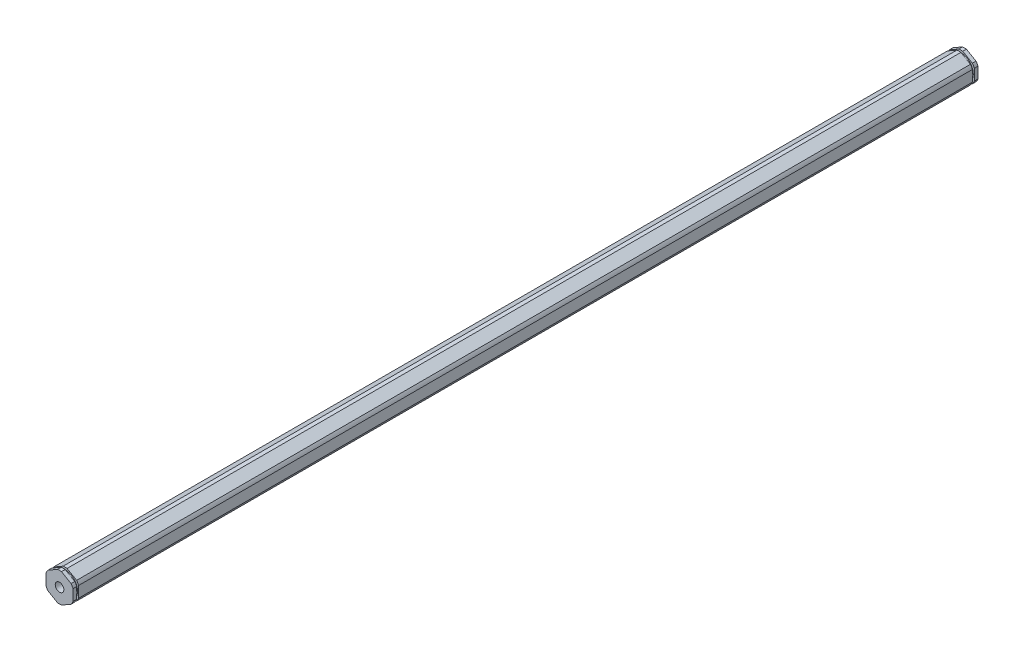
ISO-10303-21;
HEADER;
FILE_DESCRIPTION(('STEP AP214'),'2;1');
FILE_NAME('part.step','',(''),(''),'','','');
FILE_SCHEMA(('AUTOMOTIVE_DESIGN { 1 0 10303 214 1 1 1 1 }'));
ENDSEC;
DATA;
#1=APPLICATION_CONTEXT('core data for automotive mechanical design processes');
#2=APPLICATION_PROTOCOL_DEFINITION('international standard','automotive_design',2000,#1);
#3=PRODUCT_CONTEXT('',#1,'mechanical');
#4=PRODUCT('Part','Part','',(#3));
#5=PRODUCT_RELATED_PRODUCT_CATEGORY('part','',(#4));
#6=PRODUCT_DEFINITION_FORMATION('','',#4);
#7=PRODUCT_DEFINITION_CONTEXT('part definition',#1,'design');
#8=PRODUCT_DEFINITION('design','',#6,#7);
#9=PRODUCT_DEFINITION_SHAPE('','',#8);
#10=(LENGTH_UNIT() NAMED_UNIT(*) SI_UNIT(.MILLI.,.METRE.));
#11=(NAMED_UNIT(*) PLANE_ANGLE_UNIT() SI_UNIT($,.RADIAN.));
#12=(NAMED_UNIT(*) SI_UNIT($,.STERADIAN.) SOLID_ANGLE_UNIT());
#13=UNCERTAINTY_MEASURE_WITH_UNIT(LENGTH_MEASURE(1.E-05),#10,'distance_accuracy_value','');
#14=(GEOMETRIC_REPRESENTATION_CONTEXT(3) GLOBAL_UNCERTAINTY_ASSIGNED_CONTEXT((#13)) GLOBAL_UNIT_ASSIGNED_CONTEXT((#10,
#11,#12)) REPRESENTATION_CONTEXT('',''));
#15=CARTESIAN_POINT('',(0.,0.,0.));
#16=DIRECTION('',(0.,0.,1.));
#17=DIRECTION('',(1.,0.,0.));
#18=AXIS2_PLACEMENT_3D('',#15,#16,#17);
#19=CARTESIAN_POINT('',(0.,0.,212.22335));
#20=DIRECTION('',(0.,0.,-1.));
#21=DIRECTION('',(-1.,0.,0.));
#22=AXIS2_PLACEMENT_3D('',#19,#20,#21);
#23=CYLINDRICAL_SURFACE('',#22,6.858);
#24=CARTESIAN_POINT('',(0.,0.,-209.61985));
#25=DIRECTION('',(0.,0.,1.));
#26=DIRECTION('',(1.,0.,0.));
#27=AXIS2_PLACEMENT_3D('',#24,#25,#26);
#28=CIRCLE('',#27,6.858);
#29=CARTESIAN_POINT('',(5.41826726004727,-4.20411035757862,-209.61985));
#30=VERTEX_POINT('',#29);
#31=CARTESIAN_POINT('',(6.35,-2.59030191290513,-209.61985));
#32=VERTEX_POINT('',#31);
#33=EDGE_CURVE('E309',#30,#32,#28,.T.);
#34=ORIENTED_EDGE('',*,*,#33,.T.);
#35=DIRECTION('',(0.,0.,-1.));
#36=VECTOR('',#35,1.);
#37=CARTESIAN_POINT('',(6.35,-2.59030191290513,212.22335));
#38=LINE('',#37,#36);
#39=CARTESIAN_POINT('',(6.35,-2.59030191290513,209.61985));
#40=VERTEX_POINT('',#39);
#41=EDGE_CURVE('E351',#40,#32,#38,.T.);
#42=ORIENTED_EDGE('',*,*,#41,.F.);
#43=CARTESIAN_POINT('',(0.,0.,209.61985));
#44=DIRECTION('',(0.,0.,1.));
#45=DIRECTION('',(1.,0.,0.));
#46=AXIS2_PLACEMENT_3D('',#43,#44,#45);
#47=CIRCLE('',#46,6.858);
#48=CARTESIAN_POINT('',(5.41826726004727,-4.20411035757862,209.61985));
#49=VERTEX_POINT('',#48);
#50=EDGE_CURVE('E330',#49,#40,#47,.T.);
#51=ORIENTED_EDGE('',*,*,#50,.F.);
#52=DIRECTION('',(0.,0.,-1.));
#53=VECTOR('',#52,1.);
#54=CARTESIAN_POINT('',(5.41826726004727,-4.20411035757862,212.22335));
#55=LINE('',#54,#53);
#56=EDGE_CURVE('E353',#49,#30,#55,.T.);
#57=ORIENTED_EDGE('',*,*,#56,.T.);
#58=EDGE_LOOP('',(#34,#42,#51,#57));
#59=FACE_BOUND('',#58,.T.);
#60=ADVANCED_FACE('F58',(#59),#23,.T.);
#61=CARTESIAN_POINT('',(3.175,-5.49926131403118,212.22335));
#62=DIRECTION('',(-0.5,0.866025403784439,0.));
#63=DIRECTION('',(-0.866025403784439,-0.5,0.));
#64=AXIS2_PLACEMENT_3D('',#61,#62,#63);
#65=PLANE('',#64);
#66=DIRECTION('',(-0.866025403784439,-0.5,0.));
#67=VECTOR('',#66,1.);
#68=CARTESIAN_POINT('',(3.175,-5.49926131403118,-209.61985));
#69=LINE('',#68,#67);
#70=CARTESIAN_POINT('',(0.931732739952731,-6.79441227048375,-209.61985));
#71=VERTEX_POINT('',#70);
#72=EDGE_CURVE('E611',#30,#71,#69,.T.);
#73=ORIENTED_EDGE('',*,*,#72,.F.);
#74=ORIENTED_EDGE('',*,*,#56,.F.);
#75=DIRECTION('',(0.866025403784439,0.5,0.));
#76=VECTOR('',#75,1.);
#77=CARTESIAN_POINT('',(3.175,-5.49926131403118,209.61985));
#78=LINE('',#77,#76);
#79=CARTESIAN_POINT('',(0.931732739952729,-6.79441227048375,209.61985));
#80=VERTEX_POINT('',#79);
#81=EDGE_CURVE('E575',#80,#49,#78,.T.);
#82=ORIENTED_EDGE('',*,*,#81,.F.);
#83=DIRECTION('',(0.,0.,-1.));
#84=VECTOR('',#83,1.);
#85=CARTESIAN_POINT('',(0.931732739952731,-6.79441227048375,212.22335));
#86=LINE('',#85,#84);
#87=EDGE_CURVE('E382',#80,#71,#86,.T.);
#88=ORIENTED_EDGE('',*,*,#87,.T.);
#89=EDGE_LOOP('',(#73,#74,#82,#88));
#90=FACE_BOUND('',#89,.T.);
#91=ADVANCED_FACE('F669',(#90),#65,.F.);
#92=CARTESIAN_POINT('',(-0.931732739952719,-6.79441227048375,-209.61985));
#93=VERTEX_POINT('',#92);
#94=EDGE_CURVE('E355',#93,#71,#28,.T.);
#95=ORIENTED_EDGE('',*,*,#94,.T.);
#96=ORIENTED_EDGE('',*,*,#87,.F.);
#97=CARTESIAN_POINT('',(0.,0.,209.61985));
#98=DIRECTION('',(0.,0.,1.));
#99=DIRECTION('',(1.,0.,0.));
#100=AXIS2_PLACEMENT_3D('',#97,#98,#99);
#101=CIRCLE('',#100,6.858);
#102=CARTESIAN_POINT('',(-0.931732739952721,-6.79441227048375,209.61985));
#103=VERTEX_POINT('',#102);
#104=EDGE_CURVE('E590',#103,#80,#101,.T.);
#105=ORIENTED_EDGE('',*,*,#104,.F.);
#106=DIRECTION('',(0.,0.,-1.));
#107=VECTOR('',#106,1.);
#108=CARTESIAN_POINT('',(-0.931732739952721,-6.79441227048375,212.22335));
#109=LINE('',#108,#107);
#110=EDGE_CURVE('E388',#103,#93,#109,.T.);
#111=ORIENTED_EDGE('',*,*,#110,.T.);
#112=EDGE_LOOP('',(#95,#96,#105,#111));
#113=FACE_BOUND('',#112,.T.);
#114=ADVANCED_FACE('F663',(#113),#23,.T.);
#115=CARTESIAN_POINT('',(-3.175,-5.49926131403118,212.22335));
#116=DIRECTION('',(0.5,0.866025403784439,0.));
#117=DIRECTION('',(-0.866025403784439,0.5,0.));
#118=AXIS2_PLACEMENT_3D('',#115,#116,#117);
#119=PLANE('',#118);
#120=DIRECTION('',(-0.866025403784439,0.5,0.));
#121=VECTOR('',#120,1.);
#122=CARTESIAN_POINT('',(-3.175,-5.49926131403118,-209.61985));
#123=LINE('',#122,#121);
#124=CARTESIAN_POINT('',(-5.41826726004728,-4.20411035757862,-209.61985));
#125=VERTEX_POINT('',#124);
#126=EDGE_CURVE('E614',#93,#125,#123,.T.);
#127=ORIENTED_EDGE('',*,*,#126,.F.);
#128=ORIENTED_EDGE('',*,*,#110,.F.);
#129=DIRECTION('',(0.866025403784439,-0.5,0.));
#130=VECTOR('',#129,1.);
#131=CARTESIAN_POINT('',(-3.175,-5.49926131403118,209.61985));
#132=LINE('',#131,#130);
#133=CARTESIAN_POINT('',(-5.41826726004728,-4.20411035757861,209.61985));
#134=VERTEX_POINT('',#133);
#135=EDGE_CURVE('E572',#134,#103,#132,.T.);
#136=ORIENTED_EDGE('',*,*,#135,.F.);
#137=DIRECTION('',(0.,0.,-1.));
#138=VECTOR('',#137,1.);
#139=CARTESIAN_POINT('',(-5.41826726004728,-4.20411035757862,212.22335));
#140=LINE('',#139,#138);
#141=EDGE_CURVE('E394',#134,#125,#140,.T.);
#142=ORIENTED_EDGE('',*,*,#141,.T.);
#143=EDGE_LOOP('',(#127,#128,#136,#142));
#144=FACE_BOUND('',#143,.T.);
#145=ADVANCED_FACE('F725',(#144),#119,.F.);
#146=CARTESIAN_POINT('',(-6.35,-2.59030191290515,-209.61985));
#147=VERTEX_POINT('',#146);
#148=EDGE_CURVE('E646',#147,#125,#28,.T.);
#149=ORIENTED_EDGE('',*,*,#148,.T.);
#150=ORIENTED_EDGE('',*,*,#141,.F.);
#151=CARTESIAN_POINT('',(-6.35,-2.59030191290514,209.61985));
#152=VERTEX_POINT('',#151);
#153=EDGE_CURVE('E718',#152,#134,#101,.T.);
#154=ORIENTED_EDGE('',*,*,#153,.F.);
#155=DIRECTION('',(0.,0.,-1.));
#156=VECTOR('',#155,1.);
#157=CARTESIAN_POINT('',(-6.35,-2.59030191290514,212.22335));
#158=LINE('',#157,#156);
#159=EDGE_CURVE('E400',#152,#147,#158,.T.);
#160=ORIENTED_EDGE('',*,*,#159,.T.);
#161=EDGE_LOOP('',(#149,#150,#154,#160));
#162=FACE_BOUND('',#161,.T.);
#163=ADVANCED_FACE('F717',(#162),#23,.T.);
#164=CARTESIAN_POINT('',(-6.35,0.,212.22335));
#165=DIRECTION('',(1.,0.,0.));
#166=DIRECTION('',(0.,1.,0.));
#167=AXIS2_PLACEMENT_3D('',#164,#165,#166);
#168=PLANE('',#167);
#169=DIRECTION('',(0.,1.,0.));
#170=VECTOR('',#169,1.);
#171=CARTESIAN_POINT('',(-6.35,0.,-209.61985));
#172=LINE('',#171,#170);
#173=CARTESIAN_POINT('',(-6.35,2.59030191290514,-209.61985));
#174=VERTEX_POINT('',#173);
#175=EDGE_CURVE('E617',#147,#174,#172,.T.);
#176=ORIENTED_EDGE('',*,*,#175,.F.);
#177=ORIENTED_EDGE('',*,*,#159,.F.);
#178=DIRECTION('',(0.,-1.,0.));
#179=VECTOR('',#178,1.);
#180=CARTESIAN_POINT('',(-6.35,0.,209.61985));
#181=LINE('',#180,#179);
#182=CARTESIAN_POINT('',(-6.35,2.59030191290514,209.61985));
#183=VERTEX_POINT('',#182);
#184=EDGE_CURVE('E569',#183,#152,#181,.T.);
#185=ORIENTED_EDGE('',*,*,#184,.F.);
#186=DIRECTION('',(0.,0.,-1.));
#187=VECTOR('',#186,1.);
#188=CARTESIAN_POINT('',(-6.35,2.59030191290514,212.22335));
#189=LINE('',#188,#187);
#190=EDGE_CURVE('E406',#183,#174,#189,.T.);
#191=ORIENTED_EDGE('',*,*,#190,.T.);
#192=EDGE_LOOP('',(#176,#177,#185,#191));
#193=FACE_BOUND('',#192,.T.);
#194=ADVANCED_FACE('F714',(#193),#168,.F.);
#195=CARTESIAN_POINT('',(-5.41826726004727,4.20411035757862,-209.61985));
#196=VERTEX_POINT('',#195);
#197=EDGE_CURVE('E640',#196,#174,#28,.T.);
#198=ORIENTED_EDGE('',*,*,#197,.T.);
#199=ORIENTED_EDGE('',*,*,#190,.F.);
#200=CARTESIAN_POINT('',(-5.41826726004727,4.20411035757862,209.61985));
#201=VERTEX_POINT('',#200);
#202=EDGE_CURVE('E706',#201,#183,#101,.T.);
#203=ORIENTED_EDGE('',*,*,#202,.F.);
#204=DIRECTION('',(0.,0.,-1.));
#205=VECTOR('',#204,1.);
#206=CARTESIAN_POINT('',(-5.41826726004727,4.20411035757862,212.22335));
#207=LINE('',#206,#205);
#208=EDGE_CURVE('E412',#201,#196,#207,.T.);
#209=ORIENTED_EDGE('',*,*,#208,.T.);
#210=EDGE_LOOP('',(#198,#199,#203,#209));
#211=FACE_BOUND('',#210,.T.);
#212=ADVANCED_FACE('F823',(#211),#23,.T.);
#213=CARTESIAN_POINT('',(-3.175,5.49926131403119,212.22335));
#214=DIRECTION('',(0.5,-0.866025403784438,0.));
#215=DIRECTION('',(0.866025403784439,0.5,0.));
#216=AXIS2_PLACEMENT_3D('',#213,#214,#215);
#217=PLANE('',#216);
#218=DIRECTION('',(0.866025403784439,0.5,0.));
#219=VECTOR('',#218,1.);
#220=CARTESIAN_POINT('',(-3.175,5.49926131403119,-209.61985));
#221=LINE('',#220,#219);
#222=CARTESIAN_POINT('',(-0.931732739952731,6.79441227048375,-209.61985));
#223=VERTEX_POINT('',#222);
#224=EDGE_CURVE('E620',#196,#223,#221,.T.);
#225=ORIENTED_EDGE('',*,*,#224,.F.);
#226=ORIENTED_EDGE('',*,*,#208,.F.);
#227=DIRECTION('',(-0.866025403784439,-0.5,0.));
#228=VECTOR('',#227,1.);
#229=CARTESIAN_POINT('',(-3.175,5.49926131403119,209.61985));
#230=LINE('',#229,#228);
#231=CARTESIAN_POINT('',(-0.931732739952728,6.79441227048375,209.61985));
#232=VERTEX_POINT('',#231);
#233=EDGE_CURVE('E566',#232,#201,#230,.T.);
#234=ORIENTED_EDGE('',*,*,#233,.F.);
#235=DIRECTION('',(0.,0.,-1.));
#236=VECTOR('',#235,1.);
#237=CARTESIAN_POINT('',(-0.931732739952731,6.79441227048375,212.22335));
#238=LINE('',#237,#236);
#239=EDGE_CURVE('E418',#232,#223,#238,.T.);
#240=ORIENTED_EDGE('',*,*,#239,.T.);
#241=EDGE_LOOP('',(#225,#226,#234,#240));
#242=FACE_BOUND('',#241,.T.);
#243=ADVANCED_FACE('F700',(#242),#217,.F.);
#244=CARTESIAN_POINT('',(0.931732739952728,6.79441227048375,-209.61985));
#245=VERTEX_POINT('',#244);
#246=EDGE_CURVE('E634',#245,#223,#28,.T.);
#247=ORIENTED_EDGE('',*,*,#246,.T.);
#248=ORIENTED_EDGE('',*,*,#239,.F.);
#249=CARTESIAN_POINT('',(0.931732739952733,6.79441227048375,209.61985));
#250=VERTEX_POINT('',#249);
#251=EDGE_CURVE('E589',#250,#232,#101,.T.);
#252=ORIENTED_EDGE('',*,*,#251,.F.);
#253=DIRECTION('',(0.,0.,-1.));
#254=VECTOR('',#253,1.);
#255=CARTESIAN_POINT('',(0.931732739952733,6.79441227048375,212.22335));
#256=LINE('',#255,#254);
#257=EDGE_CURVE('E422',#250,#245,#256,.T.);
#258=ORIENTED_EDGE('',*,*,#257,.T.);
#259=EDGE_LOOP('',(#247,#248,#252,#258));
#260=FACE_BOUND('',#259,.T.);
#261=ADVANCED_FACE('F703',(#260),#23,.T.);
#262=CARTESIAN_POINT('',(3.175,5.49926131403119,212.22335));
#263=DIRECTION('',(-0.5,-0.866025403784438,0.));
#264=DIRECTION('',(0.866025403784439,-0.5,0.));
#265=AXIS2_PLACEMENT_3D('',#262,#263,#264);
#266=PLANE('',#265);
#267=DIRECTION('',(0.866025403784439,-0.5,0.));
#268=VECTOR('',#267,1.);
#269=CARTESIAN_POINT('',(3.175,5.49926131403119,-209.61985));
#270=LINE('',#269,#268);
#271=CARTESIAN_POINT('',(5.41826726004727,4.20411035757862,-209.61985));
#272=VERTEX_POINT('',#271);
#273=EDGE_CURVE('E623',#245,#272,#270,.T.);
#274=ORIENTED_EDGE('',*,*,#273,.F.);
#275=ORIENTED_EDGE('',*,*,#257,.F.);
#276=DIRECTION('',(-0.866025403784439,0.5,0.));
#277=VECTOR('',#276,1.);
#278=CARTESIAN_POINT('',(3.175,5.49926131403119,209.61985));
#279=LINE('',#278,#277);
#280=CARTESIAN_POINT('',(5.41826726004727,4.20411035757862,209.61985));
#281=VERTEX_POINT('',#280);
#282=EDGE_CURVE('E563',#281,#250,#279,.T.);
#283=ORIENTED_EDGE('',*,*,#282,.F.);
#284=DIRECTION('',(0.,0.,-1.));
#285=VECTOR('',#284,1.);
#286=CARTESIAN_POINT('',(5.41826726004727,4.20411035757862,212.22335));
#287=LINE('',#286,#285);
#288=EDGE_CURVE('E325',#281,#272,#287,.T.);
#289=ORIENTED_EDGE('',*,*,#288,.T.);
#290=EDGE_LOOP('',(#274,#275,#283,#289));
#291=FACE_BOUND('',#290,.T.);
#292=ADVANCED_FACE('F710',(#291),#266,.F.);
#293=CARTESIAN_POINT('',(6.35,2.59030191290513,-209.61985));
#294=VERTEX_POINT('',#293);
#295=EDGE_CURVE('E74',#294,#272,#28,.T.);
#296=ORIENTED_EDGE('',*,*,#295,.T.);
#297=ORIENTED_EDGE('',*,*,#288,.F.);
#298=CARTESIAN_POINT('',(6.35,2.59030191290513,209.61985));
#299=VERTEX_POINT('',#298);
#300=EDGE_CURVE('E586',#299,#281,#101,.T.);
#301=ORIENTED_EDGE('',*,*,#300,.F.);
#302=DIRECTION('',(0.,0.,-1.));
#303=VECTOR('',#302,1.);
#304=CARTESIAN_POINT('',(6.35,2.59030191290513,212.22335));
#305=LINE('',#304,#303);
#306=EDGE_CURVE('E317',#299,#294,#305,.T.);
#307=ORIENTED_EDGE('',*,*,#306,.T.);
#308=EDGE_LOOP('',(#296,#297,#301,#307));
#309=FACE_BOUND('',#308,.T.);
#310=ADVANCED_FACE('F806',(#309),#23,.T.);
#311=CARTESIAN_POINT('',(6.35,0.,212.22335));
#312=DIRECTION('',(-1.,0.,0.));
#313=DIRECTION('',(0.,-1.,0.));
#314=AXIS2_PLACEMENT_3D('',#311,#312,#313);
#315=PLANE('',#314);
#316=DIRECTION('',(0.,-1.,0.));
#317=VECTOR('',#316,1.);
#318=CARTESIAN_POINT('',(6.35,0.,-209.61985));
#319=LINE('',#318,#317);
#320=EDGE_CURVE('E67',#294,#32,#319,.T.);
#321=ORIENTED_EDGE('',*,*,#320,.F.);
#322=ORIENTED_EDGE('',*,*,#306,.F.);
#323=DIRECTION('',(0.,1.,0.));
#324=VECTOR('',#323,1.);
#325=CARTESIAN_POINT('',(6.35,0.,209.61985));
#326=LINE('',#325,#324);
#327=EDGE_CURVE('E358',#40,#299,#326,.T.);
#328=ORIENTED_EDGE('',*,*,#327,.F.);
#329=ORIENTED_EDGE('',*,*,#41,.T.);
#330=EDGE_LOOP('',(#321,#322,#328,#329));
#331=FACE_BOUND('',#330,.T.);
#332=ADVANCED_FACE('F357',(#331),#315,.F.);
#333=DIRECTION('',(0.,-1.,0.));
#334=VECTOR('',#333,1.);
#335=CARTESIAN_POINT('',(6.35,0.,210.50885));
#336=LINE('',#335,#334);
#337=CARTESIAN_POINT('',(6.35,2.59030191290513,210.50885));
#338=VERTEX_POINT('',#337);
#339=CARTESIAN_POINT('',(6.35,-2.59030191290513,210.50885));
#340=VERTEX_POINT('',#339);
#341=EDGE_CURVE('E543',#338,#340,#336,.T.);
#342=ORIENTED_EDGE('',*,*,#341,.F.);
#343=CARTESIAN_POINT('',(6.35,2.59030191290513,212.22335));
#344=VERTEX_POINT('',#343);
#345=EDGE_CURVE('E320',#344,#338,#305,.T.);
#346=ORIENTED_EDGE('',*,*,#345,.F.);
#347=DIRECTION('',(0.,1.,0.));
#348=VECTOR('',#347,1.);
#349=CARTESIAN_POINT('',(6.35,0.,212.22335));
#350=LINE('',#349,#348);
#351=CARTESIAN_POINT('',(6.35,-2.59030191290513,212.22335));
#352=VERTEX_POINT('',#351);
#353=EDGE_CURVE('E491',#352,#344,#350,.T.);
#354=ORIENTED_EDGE('',*,*,#353,.F.);
#355=EDGE_CURVE('E360',#352,#340,#38,.T.);
#356=ORIENTED_EDGE('',*,*,#355,.T.);
#357=EDGE_LOOP('',(#342,#346,#354,#356));
#358=FACE_BOUND('',#357,.T.);
#359=ADVANCED_FACE('F60',(#358),#315,.F.);
#360=CARTESIAN_POINT('',(0.,0.,210.50885));
#361=DIRECTION('',(0.,0.,1.));
#362=DIRECTION('',(1.,0.,0.));
#363=AXIS2_PLACEMENT_3D('',#360,#361,#362);
#364=CIRCLE('',#363,6.858);
#365=CARTESIAN_POINT('',(5.41826726004727,4.20411035757862,210.50885));
#366=VERTEX_POINT('',#365);
#367=EDGE_CURVE('E591',#338,#366,#364,.T.);
#368=ORIENTED_EDGE('',*,*,#367,.T.);
#369=CARTESIAN_POINT('',(5.41826726004727,4.20411035757862,212.22335));
#370=VERTEX_POINT('',#369);
#371=EDGE_CURVE('E318',#370,#366,#287,.T.);
#372=ORIENTED_EDGE('',*,*,#371,.F.);
#373=CARTESIAN_POINT('',(0.,0.,212.22335));
#374=DIRECTION('',(0.,0.,1.));
#375=DIRECTION('',(1.,0.,0.));
#376=AXIS2_PLACEMENT_3D('',#373,#374,#375);
#377=CIRCLE('',#376,6.858);
#378=EDGE_CURVE('E496',#344,#370,#377,.T.);
#379=ORIENTED_EDGE('',*,*,#378,.F.);
#380=ORIENTED_EDGE('',*,*,#345,.T.);
#381=EDGE_LOOP('',(#368,#372,#379,#380));
#382=FACE_BOUND('',#381,.T.);
#383=ADVANCED_FACE('F750',(#382),#23,.T.);
#384=DIRECTION('',(0.866025403784439,-0.5,0.));
#385=VECTOR('',#384,1.);
#386=CARTESIAN_POINT('',(3.175,5.49926131403119,210.50885));
#387=LINE('',#386,#385);
#388=CARTESIAN_POINT('',(0.931732739952733,6.79441227048375,210.50885));
#389=VERTEX_POINT('',#388);
#390=EDGE_CURVE('E546',#389,#366,#387,.T.);
#391=ORIENTED_EDGE('',*,*,#390,.F.);
#392=CARTESIAN_POINT('',(0.931732739952733,6.79441227048375,212.22335));
#393=VERTEX_POINT('',#392);
#394=EDGE_CURVE('E419',#393,#389,#256,.T.);
#395=ORIENTED_EDGE('',*,*,#394,.F.);
#396=DIRECTION('',(-0.866025403784439,0.5,0.));
#397=VECTOR('',#396,1.);
#398=CARTESIAN_POINT('',(3.175,5.49926131403119,212.22335));
#399=LINE('',#398,#397);
#400=EDGE_CURVE('E501',#370,#393,#399,.T.);
#401=ORIENTED_EDGE('',*,*,#400,.F.);
#402=ORIENTED_EDGE('',*,*,#371,.T.);
#403=EDGE_LOOP('',(#391,#395,#401,#402));
#404=FACE_BOUND('',#403,.T.);
#405=ADVANCED_FACE('F758',(#404),#266,.F.);
#406=CARTESIAN_POINT('',(-0.931732739952728,6.79441227048375,210.50885));
#407=VERTEX_POINT('',#406);
#408=EDGE_CURVE('E594',#389,#407,#364,.T.);
#409=ORIENTED_EDGE('',*,*,#408,.T.);
#410=CARTESIAN_POINT('',(-0.931732739952731,6.79441227048375,212.22335));
#411=VERTEX_POINT('',#410);
#412=EDGE_CURVE('E413',#411,#407,#238,.T.);
#413=ORIENTED_EDGE('',*,*,#412,.F.);
#414=EDGE_CURVE('E503',#393,#411,#377,.T.);
#415=ORIENTED_EDGE('',*,*,#414,.F.);
#416=ORIENTED_EDGE('',*,*,#394,.T.);
#417=EDGE_LOOP('',(#409,#413,#415,#416));
#418=FACE_BOUND('',#417,.T.);
#419=ADVANCED_FACE('F764',(#418),#23,.T.);
#420=DIRECTION('',(0.866025403784439,0.5,0.));
#421=VECTOR('',#420,1.);
#422=CARTESIAN_POINT('',(-3.175,5.49926131403119,210.50885));
#423=LINE('',#422,#421);
#424=CARTESIAN_POINT('',(-5.41826726004727,4.20411035757862,210.50885));
#425=VERTEX_POINT('',#424);
#426=EDGE_CURVE('E549',#425,#407,#423,.T.);
#427=ORIENTED_EDGE('',*,*,#426,.F.);
#428=CARTESIAN_POINT('',(-5.41826726004727,4.20411035757862,212.22335));
#429=VERTEX_POINT('',#428);
#430=EDGE_CURVE('E407',#429,#425,#207,.T.);
#431=ORIENTED_EDGE('',*,*,#430,.F.);
#432=DIRECTION('',(-0.866025403784439,-0.5,0.));
#433=VECTOR('',#432,1.);
#434=CARTESIAN_POINT('',(-3.175,5.49926131403119,212.22335));
#435=LINE('',#434,#433);
#436=EDGE_CURVE('E510',#411,#429,#435,.T.);
#437=ORIENTED_EDGE('',*,*,#436,.F.);
#438=ORIENTED_EDGE('',*,*,#412,.T.);
#439=EDGE_LOOP('',(#427,#431,#437,#438));
#440=FACE_BOUND('',#439,.T.);
#441=ADVANCED_FACE('F796',(#440),#217,.F.);
#442=CARTESIAN_POINT('',(-6.35,2.59030191290514,210.50885));
#443=VERTEX_POINT('',#442);
#444=EDGE_CURVE('E1191',#425,#443,#364,.T.);
#445=ORIENTED_EDGE('',*,*,#444,.T.);
#446=CARTESIAN_POINT('',(-6.35,2.59030191290514,212.22335));
#447=VERTEX_POINT('',#446);
#448=EDGE_CURVE('E401',#447,#443,#189,.T.);
#449=ORIENTED_EDGE('',*,*,#448,.F.);
#450=EDGE_CURVE('E513',#429,#447,#377,.T.);
#451=ORIENTED_EDGE('',*,*,#450,.F.);
#452=ORIENTED_EDGE('',*,*,#430,.T.);
#453=EDGE_LOOP('',(#445,#449,#451,#452));
#454=FACE_BOUND('',#453,.T.);
#455=ADVANCED_FACE('F788',(#454),#23,.T.);
#456=DIRECTION('',(0.,1.,0.));
#457=VECTOR('',#456,1.);
#458=CARTESIAN_POINT('',(-6.35,0.,210.50885));
#459=LINE('',#458,#457);
#460=CARTESIAN_POINT('',(-6.35,-2.59030191290514,210.50885));
#461=VERTEX_POINT('',#460);
#462=EDGE_CURVE('E552',#461,#443,#459,.T.);
#463=ORIENTED_EDGE('',*,*,#462,.F.);
#464=CARTESIAN_POINT('',(-6.35,-2.59030191290514,212.22335));
#465=VERTEX_POINT('',#464);
#466=EDGE_CURVE('E395',#465,#461,#158,.T.);
#467=ORIENTED_EDGE('',*,*,#466,.F.);
#468=DIRECTION('',(0.,-1.,0.));
#469=VECTOR('',#468,1.);
#470=CARTESIAN_POINT('',(-6.35,0.,212.22335));
#471=LINE('',#470,#469);
#472=EDGE_CURVE('E514',#447,#465,#471,.T.);
#473=ORIENTED_EDGE('',*,*,#472,.F.);
#474=ORIENTED_EDGE('',*,*,#448,.T.);
#475=EDGE_LOOP('',(#463,#467,#473,#474));
#476=FACE_BOUND('',#475,.T.);
#477=ADVANCED_FACE('F786',(#476),#168,.F.);
#478=CARTESIAN_POINT('',(-5.41826726004728,-4.20411035757861,210.50885));
#479=VERTEX_POINT('',#478);
#480=EDGE_CURVE('E1189',#461,#479,#364,.T.);
#481=ORIENTED_EDGE('',*,*,#480,.T.);
#482=CARTESIAN_POINT('',(-5.41826726004728,-4.20411035757862,212.22335));
#483=VERTEX_POINT('',#482);
#484=EDGE_CURVE('E389',#483,#479,#140,.T.);
#485=ORIENTED_EDGE('',*,*,#484,.F.);
#486=EDGE_CURVE('E517',#465,#483,#377,.T.);
#487=ORIENTED_EDGE('',*,*,#486,.F.);
#488=ORIENTED_EDGE('',*,*,#466,.T.);
#489=EDGE_LOOP('',(#481,#485,#487,#488));
#490=FACE_BOUND('',#489,.T.);
#491=ADVANCED_FACE('F740',(#490),#23,.T.);
#492=DIRECTION('',(-0.866025403784439,0.5,0.));
#493=VECTOR('',#492,1.);
#494=CARTESIAN_POINT('',(-3.175,-5.49926131403118,210.50885));
#495=LINE('',#494,#493);
#496=CARTESIAN_POINT('',(-0.931732739952721,-6.79441227048375,210.50885));
#497=VERTEX_POINT('',#496);
#498=EDGE_CURVE('E555',#497,#479,#495,.T.);
#499=ORIENTED_EDGE('',*,*,#498,.F.);
#500=CARTESIAN_POINT('',(-0.931732739952721,-6.79441227048375,212.22335));
#501=VERTEX_POINT('',#500);
#502=EDGE_CURVE('E383',#501,#497,#109,.T.);
#503=ORIENTED_EDGE('',*,*,#502,.F.);
#504=DIRECTION('',(0.866025403784439,-0.5,0.));
#505=VECTOR('',#504,1.);
#506=CARTESIAN_POINT('',(-3.175,-5.49926131403118,212.22335));
#507=LINE('',#506,#505);
#508=EDGE_CURVE('E518',#483,#501,#507,.T.);
#509=ORIENTED_EDGE('',*,*,#508,.F.);
#510=ORIENTED_EDGE('',*,*,#484,.T.);
#511=EDGE_LOOP('',(#499,#503,#509,#510));
#512=FACE_BOUND('',#511,.T.);
#513=ADVANCED_FACE('F728',(#512),#119,.F.);
#514=CARTESIAN_POINT('',(0.931732739952729,-6.79441227048375,210.50885));
#515=VERTEX_POINT('',#514);
#516=EDGE_CURVE('E595',#497,#515,#364,.T.);
#517=ORIENTED_EDGE('',*,*,#516,.T.);
#518=CARTESIAN_POINT('',(0.931732739952731,-6.79441227048375,212.22335));
#519=VERTEX_POINT('',#518);
#520=EDGE_CURVE('E377',#519,#515,#86,.T.);
#521=ORIENTED_EDGE('',*,*,#520,.F.);
#522=EDGE_CURVE('E521',#501,#519,#377,.T.);
#523=ORIENTED_EDGE('',*,*,#522,.F.);
#524=ORIENTED_EDGE('',*,*,#502,.T.);
#525=EDGE_LOOP('',(#517,#521,#523,#524));
#526=FACE_BOUND('',#525,.T.);
#527=ADVANCED_FACE('F739',(#526),#23,.T.);
#528=DIRECTION('',(-0.866025403784439,-0.5,0.));
#529=VECTOR('',#528,1.);
#530=CARTESIAN_POINT('',(3.175,-5.49926131403118,210.50885));
#531=LINE('',#530,#529);
#532=CARTESIAN_POINT('',(5.41826726004727,-4.20411035757862,210.50885));
#533=VERTEX_POINT('',#532);
#534=EDGE_CURVE('E558',#533,#515,#531,.T.);
#535=ORIENTED_EDGE('',*,*,#534,.F.);
#536=CARTESIAN_POINT('',(5.41826726004727,-4.20411035757862,212.22335));
#537=VERTEX_POINT('',#536);
#538=EDGE_CURVE('E372',#537,#533,#55,.T.);
#539=ORIENTED_EDGE('',*,*,#538,.F.);
#540=DIRECTION('',(0.866025403784439,0.5,0.));
#541=VECTOR('',#540,1.);
#542=CARTESIAN_POINT('',(3.175,-5.49926131403118,212.22335));
#543=LINE('',#542,#541);
#544=EDGE_CURVE('E522',#519,#537,#543,.T.);
#545=ORIENTED_EDGE('',*,*,#544,.F.);
#546=ORIENTED_EDGE('',*,*,#520,.T.);
#547=EDGE_LOOP('',(#535,#539,#545,#546));
#548=FACE_BOUND('',#547,.T.);
#549=ADVANCED_FACE('F749',(#548),#65,.F.);
#550=CARTESIAN_POINT('',(0.,0.,210.50885));
#551=DIRECTION('',(0.,0.,-1.));
#552=DIRECTION('',(-1.,0.,0.));
#553=AXIS2_PLACEMENT_3D('',#550,#551,#552);
#554=CIRCLE('',#553,6.858);
#555=EDGE_CURVE('E335',#340,#533,#554,.T.);
#556=ORIENTED_EDGE('',*,*,#555,.F.);
#557=ORIENTED_EDGE('',*,*,#355,.F.);
#558=EDGE_CURVE('E367',#537,#352,#377,.T.);
#559=ORIENTED_EDGE('',*,*,#558,.F.);
#560=ORIENTED_EDGE('',*,*,#538,.T.);
#561=EDGE_LOOP('',(#556,#557,#559,#560));
#562=FACE_BOUND('',#561,.T.);
#563=ADVANCED_FACE('F759',(#562),#23,.T.);
#564=CARTESIAN_POINT('',(0.,0.,212.22335));
#565=DIRECTION('',(0.,0.,1.));
#566=DIRECTION('',(1.,0.,0.));
#567=AXIS2_PLACEMENT_3D('',#564,#565,#566);
#568=PLANE('',#567);
#569=CARTESIAN_POINT('',(0.,0.,212.22335));
#570=DIRECTION('',(0.,0.,1.));
#571=DIRECTION('',(1.,0.,0.));
#572=AXIS2_PLACEMENT_3D('',#569,#570,#571);
#573=CIRCLE('',#572,2.01929999999999);
#574=CARTESIAN_POINT('',(2.01929999999999,0.,212.22335));
#575=VERTEX_POINT('',#574);
#576=EDGE_CURVE('E537',#575,#575,#573,.T.);
#577=ORIENTED_EDGE('',*,*,#576,.F.);
#578=EDGE_LOOP('',(#577));
#579=FACE_BOUND('',#578,.T.);
#580=ORIENTED_EDGE('',*,*,#353,.T.);
#581=ORIENTED_EDGE('',*,*,#378,.T.);
#582=ORIENTED_EDGE('',*,*,#400,.T.);
#583=ORIENTED_EDGE('',*,*,#414,.T.);
#584=ORIENTED_EDGE('',*,*,#436,.T.);
#585=ORIENTED_EDGE('',*,*,#450,.T.);
#586=ORIENTED_EDGE('',*,*,#472,.T.);
#587=ORIENTED_EDGE('',*,*,#486,.T.);
#588=ORIENTED_EDGE('',*,*,#508,.T.);
#589=ORIENTED_EDGE('',*,*,#522,.T.);
#590=ORIENTED_EDGE('',*,*,#544,.T.);
#591=ORIENTED_EDGE('',*,*,#558,.T.);
#592=EDGE_LOOP('',(#580,#581,#582,#583,#584,#585,#586,#587,#588,#589,#590,#591));
#593=FACE_BOUND('',#592,.T.);
#594=ADVANCED_FACE('F768',(#579,#593),#568,.T.);
#595=CARTESIAN_POINT('',(0.,0.,195.87591));
#596=DIRECTION('',(0.,0.,1.));
#597=DIRECTION('',(1.,0.,0.));
#598=AXIS2_PLACEMENT_3D('',#595,#596,#597);
#599=CONICAL_SURFACE('',#598,2.01929999999999,1.02974425867665);
#600=CARTESIAN_POINT('',(0.,0.,194.662592151998));
#601=VERTEX_POINT('',#600);
#602=VERTEX_LOOP('',#601);
#603=FACE_BOUND('',#602,.T.);
#604=CARTESIAN_POINT('',(0.,0.,195.87591));
#605=DIRECTION('',(0.,0.,1.));
#606=DIRECTION('',(1.,0.,0.));
#607=AXIS2_PLACEMENT_3D('',#604,#605,#606);
#608=CIRCLE('',#607,2.01929999999999);
#609=CARTESIAN_POINT('',(2.01929999999999,0.,195.87591));
#610=VERTEX_POINT('',#609);
#611=EDGE_CURVE('E532',#610,#610,#608,.T.);
#612=ORIENTED_EDGE('',*,*,#611,.T.);
#613=EDGE_LOOP('',(#612));
#614=FACE_BOUND('',#613,.T.);
#615=ADVANCED_FACE('F775',(#603,#614),#599,.F.);
#616=CARTESIAN_POINT('',(0.,0.,212.22335));
#617=DIRECTION('',(0.,0.,1.));
#618=DIRECTION('',(1.,0.,0.));
#619=AXIS2_PLACEMENT_3D('',#616,#617,#618);
#620=CYLINDRICAL_SURFACE('',#619,2.01929999999999);
#621=ORIENTED_EDGE('',*,*,#611,.F.);
#622=EDGE_LOOP('',(#621));
#623=FACE_BOUND('',#622,.T.);
#624=ORIENTED_EDGE('',*,*,#576,.T.);
#625=EDGE_LOOP('',(#624));
#626=FACE_BOUND('',#625,.T.);
#627=ADVANCED_FACE('F1029',(#623,#626),#620,.F.);
#628=CARTESIAN_POINT('',(0.,6.858,210.50885));
#629=DIRECTION('',(0.,0.,-1.));
#630=DIRECTION('',(-1.,0.,0.));
#631=AXIS2_PLACEMENT_3D('',#628,#629,#630);
#632=PLANE('',#631);
#633=CARTESIAN_POINT('',(0.,0.,210.50885));
#634=DIRECTION('',(0.,0.,1.));
#635=DIRECTION('',(1.,0.,0.));
#636=AXIS2_PLACEMENT_3D('',#633,#634,#635);
#637=CIRCLE('',#636,5.8547);
#638=CARTESIAN_POINT('',(5.8547,0.,210.50885));
#639=VERTEX_POINT('',#638);
#640=EDGE_CURVE('E578',#639,#639,#637,.T.);
#641=ORIENTED_EDGE('',*,*,#640,.T.);
#642=EDGE_LOOP('',(#641));
#643=FACE_BOUND('',#642,.T.);
#644=ORIENTED_EDGE('',*,*,#341,.T.);
#645=ORIENTED_EDGE('',*,*,#555,.T.);
#646=ORIENTED_EDGE('',*,*,#534,.T.);
#647=ORIENTED_EDGE('',*,*,#516,.F.);
#648=ORIENTED_EDGE('',*,*,#498,.T.);
#649=ORIENTED_EDGE('',*,*,#480,.F.);
#650=ORIENTED_EDGE('',*,*,#462,.T.);
#651=ORIENTED_EDGE('',*,*,#444,.F.);
#652=ORIENTED_EDGE('',*,*,#426,.T.);
#653=ORIENTED_EDGE('',*,*,#408,.F.);
#654=ORIENTED_EDGE('',*,*,#390,.T.);
#655=ORIENTED_EDGE('',*,*,#367,.F.);
#656=EDGE_LOOP('',(#644,#645,#646,#647,#648,#649,#650,#651,#652,#653,#654,#655));
#657=FACE_BOUND('',#656,.T.);
#658=ADVANCED_FACE('F1020',(#643,#657),#632,.T.);
#659=CARTESIAN_POINT('',(0.,6.858,209.61985));
#660=DIRECTION('',(0.,0.,1.));
#661=DIRECTION('',(1.,0.,0.));
#662=AXIS2_PLACEMENT_3D('',#659,#660,#661);
#663=PLANE('',#662);
#664=CARTESIAN_POINT('',(0.,0.,209.61985));
#665=DIRECTION('',(0.,0.,1.));
#666=DIRECTION('',(1.,0.,0.));
#667=AXIS2_PLACEMENT_3D('',#664,#665,#666);
#668=CIRCLE('',#667,5.8547);
#669=CARTESIAN_POINT('',(5.8547,0.,209.61985));
#670=VERTEX_POINT('',#669);
#671=EDGE_CURVE('E582',#670,#670,#668,.T.);
#672=ORIENTED_EDGE('',*,*,#671,.F.);
#673=EDGE_LOOP('',(#672));
#674=FACE_BOUND('',#673,.T.);
#675=ORIENTED_EDGE('',*,*,#327,.T.);
#676=ORIENTED_EDGE('',*,*,#300,.T.);
#677=ORIENTED_EDGE('',*,*,#282,.T.);
#678=ORIENTED_EDGE('',*,*,#251,.T.);
#679=ORIENTED_EDGE('',*,*,#233,.T.);
#680=ORIENTED_EDGE('',*,*,#202,.T.);
#681=ORIENTED_EDGE('',*,*,#184,.T.);
#682=ORIENTED_EDGE('',*,*,#153,.T.);
#683=ORIENTED_EDGE('',*,*,#135,.T.);
#684=ORIENTED_EDGE('',*,*,#104,.T.);
#685=ORIENTED_EDGE('',*,*,#81,.T.);
#686=ORIENTED_EDGE('',*,*,#50,.T.);
#687=EDGE_LOOP('',(#675,#676,#677,#678,#679,#680,#681,#682,#683,#684,#685,#686));
#688=FACE_BOUND('',#687,.T.);
#689=ADVANCED_FACE('F723',(#674,#688),#663,.T.);
#690=CARTESIAN_POINT('',(0.,0.,165.047176272324));
#691=DIRECTION('',(0.,0.,1.));
#692=DIRECTION('',(1.,0.,0.));
#693=AXIS2_PLACEMENT_3D('',#690,#691,#692);
#694=CYLINDRICAL_SURFACE('',#693,5.8547);
#695=ORIENTED_EDGE('',*,*,#671,.T.);
#696=EDGE_LOOP('',(#695));
#697=FACE_BOUND('',#696,.T.);
#698=ORIENTED_EDGE('',*,*,#640,.F.);
#699=EDGE_LOOP('',(#698));
#700=FACE_BOUND('',#699,.T.);
#701=ADVANCED_FACE('F893',(#697,#700),#694,.T.);
#702=CARTESIAN_POINT('',(0.,6.858,-210.50885));
#703=DIRECTION('',(0.,0.,1.));
#704=DIRECTION('',(-1.,0.,0.));
#705=AXIS2_PLACEMENT_3D('',#702,#703,#704);
#706=PLANE('',#705);
#707=CARTESIAN_POINT('',(0.,0.,-210.50885));
#708=DIRECTION('',(0.,0.,1.));
#709=DIRECTION('',(1.,0.,0.));
#710=AXIS2_PLACEMENT_3D('',#707,#708,#709);
#711=CIRCLE('',#710,5.8547);
#712=CARTESIAN_POINT('',(5.8547,0.,-210.50885));
#713=VERTEX_POINT('',#712);
#714=EDGE_CURVE('E626',#713,#713,#711,.T.);
#715=ORIENTED_EDGE('',*,*,#714,.F.);
#716=EDGE_LOOP('',(#715));
#717=FACE_BOUND('',#716,.T.);
#718=DIRECTION('',(0.866025403784439,0.5,0.));
#719=VECTOR('',#718,1.);
#720=CARTESIAN_POINT('',(3.175,-5.49926131403118,-210.50885));
#721=LINE('',#720,#719);
#722=CARTESIAN_POINT('',(0.931732739952731,-6.79441227048375,-210.50885));
#723=VERTEX_POINT('',#722);
#724=CARTESIAN_POINT('',(5.41826726004727,-4.20411035757862,-210.50885));
#725=VERTEX_POINT('',#724);
#726=EDGE_CURVE('E596',#723,#725,#721,.T.);
#727=ORIENTED_EDGE('',*,*,#726,.T.);
#728=CARTESIAN_POINT('',(0.,0.,-210.50885));
#729=DIRECTION('',(0.,0.,1.));
#730=DIRECTION('',(1.,0.,0.));
#731=AXIS2_PLACEMENT_3D('',#728,#729,#730);
#732=CIRCLE('',#731,6.858);
#733=CARTESIAN_POINT('',(6.35,-2.59030191290513,-210.50885));
#734=VERTEX_POINT('',#733);
#735=EDGE_CURVE('E81',#725,#734,#732,.T.);
#736=ORIENTED_EDGE('',*,*,#735,.T.);
#737=DIRECTION('',(0.,1.,0.));
#738=VECTOR('',#737,1.);
#739=CARTESIAN_POINT('',(6.35,0.,-210.50885));
#740=LINE('',#739,#738);
#741=CARTESIAN_POINT('',(6.35,2.59030191290514,-210.50885));
#742=VERTEX_POINT('',#741);
#743=EDGE_CURVE('E11',#734,#742,#740,.T.);
#744=ORIENTED_EDGE('',*,*,#743,.T.);
#745=CARTESIAN_POINT('',(5.41826726004727,4.20411035757862,-210.50885));
#746=VERTEX_POINT('',#745);
#747=EDGE_CURVE('E296',#742,#746,#732,.T.);
#748=ORIENTED_EDGE('',*,*,#747,.T.);
#749=DIRECTION('',(-0.866025403784439,0.5,0.));
#750=VECTOR('',#749,1.);
#751=CARTESIAN_POINT('',(3.175,5.49926131403119,-210.50885));
#752=LINE('',#751,#750);
#753=CARTESIAN_POINT('',(0.931732739952728,6.79441227048375,-210.50885));
#754=VERTEX_POINT('',#753);
#755=EDGE_CURVE('E608',#746,#754,#752,.T.);
#756=ORIENTED_EDGE('',*,*,#755,.T.);
#757=CARTESIAN_POINT('',(-0.931732739952731,6.79441227048375,-210.50885));
#758=VERTEX_POINT('',#757);
#759=EDGE_CURVE('E310',#754,#758,#732,.T.);
#760=ORIENTED_EDGE('',*,*,#759,.T.);
#761=DIRECTION('',(-0.866025403784439,-0.5,0.));
#762=VECTOR('',#761,1.);
#763=CARTESIAN_POINT('',(-3.175,5.49926131403119,-210.50885));
#764=LINE('',#763,#762);
#765=CARTESIAN_POINT('',(-5.41826726004727,4.20411035757862,-210.50885));
#766=VERTEX_POINT('',#765);
#767=EDGE_CURVE('E605',#758,#766,#764,.T.);
#768=ORIENTED_EDGE('',*,*,#767,.T.);
#769=CARTESIAN_POINT('',(-6.35,2.59030191290514,-210.50885));
#770=VERTEX_POINT('',#769);
#771=EDGE_CURVE('E839',#766,#770,#732,.T.);
#772=ORIENTED_EDGE('',*,*,#771,.T.);
#773=DIRECTION('',(0.,-1.,0.));
#774=VECTOR('',#773,1.);
#775=CARTESIAN_POINT('',(-6.35,0.,-210.50885));
#776=LINE('',#775,#774);
#777=CARTESIAN_POINT('',(-6.35,-2.59030191290515,-210.50885));
#778=VERTEX_POINT('',#777);
#779=EDGE_CURVE('E602',#770,#778,#776,.T.);
#780=ORIENTED_EDGE('',*,*,#779,.T.);
#781=CARTESIAN_POINT('',(-5.41826726004728,-4.20411035757862,-210.50885));
#782=VERTEX_POINT('',#781);
#783=EDGE_CURVE('E681',#778,#782,#732,.T.);
#784=ORIENTED_EDGE('',*,*,#783,.T.);
#785=DIRECTION('',(0.866025403784439,-0.5,0.));
#786=VECTOR('',#785,1.);
#787=CARTESIAN_POINT('',(-3.175,-5.49926131403118,-210.50885));
#788=LINE('',#787,#786);
#789=CARTESIAN_POINT('',(-0.931732739952719,-6.79441227048375,-210.50885));
#790=VERTEX_POINT('',#789);
#791=EDGE_CURVE('E599',#782,#790,#788,.T.);
#792=ORIENTED_EDGE('',*,*,#791,.T.);
#793=EDGE_CURVE('E678',#790,#723,#732,.T.);
#794=ORIENTED_EDGE('',*,*,#793,.T.);
#795=EDGE_LOOP('',(#727,#736,#744,#748,#756,#760,#768,#772,#780,#784,#792,#794));
#796=FACE_BOUND('',#795,.T.);
#797=ADVANCED_FACE('F295',(#717,#796),#706,.T.);
#798=CARTESIAN_POINT('',(0.,6.858,-209.61985));
#799=DIRECTION('',(0.,0.,-1.));
#800=DIRECTION('',(1.,0.,0.));
#801=AXIS2_PLACEMENT_3D('',#798,#799,#800);
#802=PLANE('',#801);
#803=CARTESIAN_POINT('',(0.,0.,-209.61985));
#804=DIRECTION('',(0.,0.,1.));
#805=DIRECTION('',(1.,0.,0.));
#806=AXIS2_PLACEMENT_3D('',#803,#804,#805);
#807=CIRCLE('',#806,5.8547);
#808=CARTESIAN_POINT('',(5.8547,0.,-209.61985));
#809=VERTEX_POINT('',#808);
#810=EDGE_CURVE('E630',#809,#809,#807,.T.);
#811=ORIENTED_EDGE('',*,*,#810,.T.);
#812=EDGE_LOOP('',(#811));
#813=FACE_BOUND('',#812,.T.);
#814=ORIENTED_EDGE('',*,*,#72,.T.);
#815=ORIENTED_EDGE('',*,*,#94,.F.);
#816=ORIENTED_EDGE('',*,*,#126,.T.);
#817=ORIENTED_EDGE('',*,*,#148,.F.);
#818=ORIENTED_EDGE('',*,*,#175,.T.);
#819=ORIENTED_EDGE('',*,*,#197,.F.);
#820=ORIENTED_EDGE('',*,*,#224,.T.);
#821=ORIENTED_EDGE('',*,*,#246,.F.);
#822=ORIENTED_EDGE('',*,*,#273,.T.);
#823=ORIENTED_EDGE('',*,*,#295,.F.);
#824=ORIENTED_EDGE('',*,*,#320,.T.);
#825=ORIENTED_EDGE('',*,*,#33,.F.);
#826=EDGE_LOOP('',(#814,#815,#816,#817,#818,#819,#820,#821,#822,#823,#824,#825));
#827=FACE_BOUND('',#826,.T.);
#828=ADVANCED_FACE('F343',(#813,#827),#802,.T.);
#829=CARTESIAN_POINT('',(0.,0.,-165.047176272324));
#830=DIRECTION('',(0.,0.,-1.));
#831=DIRECTION('',(1.,0.,0.));
#832=AXIS2_PLACEMENT_3D('',#829,#830,#831);
#833=CYLINDRICAL_SURFACE('',#832,5.8547);
#834=ORIENTED_EDGE('',*,*,#810,.F.);
#835=EDGE_LOOP('',(#834));
#836=FACE_BOUND('',#835,.T.);
#837=ORIENTED_EDGE('',*,*,#714,.T.);
#838=EDGE_LOOP('',(#837));
#839=FACE_BOUND('',#838,.T.);
#840=ADVANCED_FACE('F903',(#836,#839),#833,.T.);
#841=CARTESIAN_POINT('',(0.,0.,-195.87591));
#842=DIRECTION('',(0.,0.,-1.));
#843=DIRECTION('',(-1.,0.,0.));
#844=AXIS2_PLACEMENT_3D('',#841,#842,#843);
#845=CONICAL_SURFACE('',#844,2.01929999999999,1.02974425867665);
#846=CARTESIAN_POINT('',(0.,0.,-194.662592151998));
#847=VERTEX_POINT('',#846);
#848=VERTEX_LOOP('',#847);
#849=FACE_BOUND('',#848,.T.);
#850=CARTESIAN_POINT('',(0.,0.,-195.87591));
#851=DIRECTION('',(0.,0.,-1.));
#852=DIRECTION('',(-1.,0.,0.));
#853=AXIS2_PLACEMENT_3D('',#850,#851,#852);
#854=CIRCLE('',#853,2.01929999999999);
#855=CARTESIAN_POINT('',(-2.01929999999999,0.,-195.87591));
#856=VERTEX_POINT('',#855);
#857=EDGE_CURVE('E505',#856,#856,#854,.T.);
#858=ORIENTED_EDGE('',*,*,#857,.T.);
#859=EDGE_LOOP('',(#858));
#860=FACE_BOUND('',#859,.T.);
#861=ADVANCED_FACE('F912',(#849,#860),#845,.F.);
#862=CARTESIAN_POINT('',(0.,0.,-212.22335));
#863=DIRECTION('',(0.,0.,-1.));
#864=DIRECTION('',(-1.,0.,0.));
#865=AXIS2_PLACEMENT_3D('',#862,#863,#864);
#866=CYLINDRICAL_SURFACE('',#865,2.01929999999999);
#867=ORIENTED_EDGE('',*,*,#857,.F.);
#868=EDGE_LOOP('',(#867));
#869=FACE_BOUND('',#868,.T.);
#870=CARTESIAN_POINT('',(0.,0.,-212.22335));
#871=DIRECTION('',(0.,0.,-1.));
#872=DIRECTION('',(-1.,0.,0.));
#873=AXIS2_PLACEMENT_3D('',#870,#871,#872);
#874=CIRCLE('',#873,2.01929999999999);
#875=CARTESIAN_POINT('',(-2.01929999999999,0.,-212.22335));
#876=VERTEX_POINT('',#875);
#877=EDGE_CURVE('E527',#876,#876,#874,.T.);
#878=ORIENTED_EDGE('',*,*,#877,.T.);
#879=EDGE_LOOP('',(#878));
#880=FACE_BOUND('',#879,.T.);
#881=ADVANCED_FACE('F1110',(#869,#880),#866,.F.);
#882=CARTESIAN_POINT('',(0.,0.,-212.22335));
#883=DIRECTION('',(0.,0.,1.));
#884=DIRECTION('',(1.,0.,0.));
#885=AXIS2_PLACEMENT_3D('',#882,#883,#884);
#886=PLANE('',#885);
#887=ORIENTED_EDGE('',*,*,#877,.F.);
#888=EDGE_LOOP('',(#887));
#889=FACE_BOUND('',#888,.T.);
#890=DIRECTION('',(0.,1.,0.));
#891=VECTOR('',#890,1.);
#892=CARTESIAN_POINT('',(6.35,0.,-212.22335));
#893=LINE('',#892,#891);
#894=CARTESIAN_POINT('',(6.35,-2.59030191290513,-212.22335));
#895=VERTEX_POINT('',#894);
#896=CARTESIAN_POINT('',(6.35,2.59030191290513,-212.22335));
#897=VERTEX_POINT('',#896);
#898=EDGE_CURVE('E315',#895,#897,#893,.T.);
#899=ORIENTED_EDGE('',*,*,#898,.F.);
#900=CARTESIAN_POINT('',(0.,0.,-212.22335));
#901=DIRECTION('',(0.,0.,1.));
#902=DIRECTION('',(1.,0.,0.));
#903=AXIS2_PLACEMENT_3D('',#900,#901,#902);
#904=CIRCLE('',#903,6.858);
#905=CARTESIAN_POINT('',(5.41826726004727,-4.20411035757862,-212.22335));
#906=VERTEX_POINT('',#905);
#907=EDGE_CURVE('E460',#906,#895,#904,.T.);
#908=ORIENTED_EDGE('',*,*,#907,.F.);
#909=DIRECTION('',(0.866025403784439,0.5,0.));
#910=VECTOR('',#909,1.);
#911=CARTESIAN_POINT('',(3.175,-5.49926131403118,-212.22335));
#912=LINE('',#911,#910);
#913=CARTESIAN_POINT('',(0.931732739952731,-6.79441227048375,-212.22335));
#914=VERTEX_POINT('',#913);
#915=EDGE_CURVE('E370',#914,#906,#912,.T.);
#916=ORIENTED_EDGE('',*,*,#915,.F.);
#917=CARTESIAN_POINT('',(-0.931732739952721,-6.79441227048375,-212.22335));
#918=VERTEX_POINT('',#917);
#919=EDGE_CURVE('E474',#918,#914,#904,.T.);
#920=ORIENTED_EDGE('',*,*,#919,.F.);
#921=DIRECTION('',(0.866025403784439,-0.5,0.));
#922=VECTOR('',#921,1.);
#923=CARTESIAN_POINT('',(-3.175,-5.49926131403118,-212.22335));
#924=LINE('',#923,#922);
#925=CARTESIAN_POINT('',(-5.41826726004728,-4.20411035757862,-212.22335));
#926=VERTEX_POINT('',#925);
#927=EDGE_CURVE('E473',#926,#918,#924,.T.);
#928=ORIENTED_EDGE('',*,*,#927,.F.);
#929=CARTESIAN_POINT('',(-6.35,-2.59030191290514,-212.22335));
#930=VERTEX_POINT('',#929);
#931=EDGE_CURVE('E464',#930,#926,#904,.T.);
#932=ORIENTED_EDGE('',*,*,#931,.F.);
#933=DIRECTION('',(0.,-1.,0.));
#934=VECTOR('',#933,1.);
#935=CARTESIAN_POINT('',(-6.35,0.,-212.22335));
#936=LINE('',#935,#934);
#937=CARTESIAN_POINT('',(-6.35,2.59030191290514,-212.22335));
#938=VERTEX_POINT('',#937);
#939=EDGE_CURVE('E463',#938,#930,#936,.T.);
#940=ORIENTED_EDGE('',*,*,#939,.F.);
#941=CARTESIAN_POINT('',(-5.41826726004727,4.20411035757862,-212.22335));
#942=VERTEX_POINT('',#941);
#943=EDGE_CURVE('E455',#942,#938,#904,.T.);
#944=ORIENTED_EDGE('',*,*,#943,.F.);
#945=DIRECTION('',(-0.866025403784439,-0.5,0.));
#946=VECTOR('',#945,1.);
#947=CARTESIAN_POINT('',(-3.175,5.49926131403119,-212.22335));
#948=LINE('',#947,#946);
#949=CARTESIAN_POINT('',(-0.931732739952731,6.79441227048375,-212.22335));
#950=VERTEX_POINT('',#949);
#951=EDGE_CURVE('E452',#950,#942,#948,.T.);
#952=ORIENTED_EDGE('',*,*,#951,.F.);
#953=CARTESIAN_POINT('',(0.931732739952733,6.79441227048375,-212.22335));
#954=VERTEX_POINT('',#953);
#955=EDGE_CURVE('E439',#954,#950,#904,.T.);
#956=ORIENTED_EDGE('',*,*,#955,.F.);
#957=DIRECTION('',(-0.866025403784439,0.5,0.));
#958=VECTOR('',#957,1.);
#959=CARTESIAN_POINT('',(3.175,5.49926131403119,-212.22335));
#960=LINE('',#959,#958);
#961=CARTESIAN_POINT('',(5.41826726004727,4.20411035757862,-212.22335));
#962=VERTEX_POINT('',#961);
#963=EDGE_CURVE('E443',#962,#954,#960,.T.);
#964=ORIENTED_EDGE('',*,*,#963,.F.);
#965=EDGE_CURVE('E447',#897,#962,#904,.T.);
#966=ORIENTED_EDGE('',*,*,#965,.F.);
#967=EDGE_LOOP('',(#899,#908,#916,#920,#928,#932,#940,#944,#952,#956,#964,#966));
#968=FACE_BOUND('',#967,.T.);
#969=ADVANCED_FACE('F449',(#889,#968),#886,.F.);
#970=ORIENTED_EDGE('',*,*,#743,.F.);
#971=EDGE_CURVE('E361',#734,#895,#38,.T.);
#972=ORIENTED_EDGE('',*,*,#971,.T.);
#973=ORIENTED_EDGE('',*,*,#898,.T.);
#974=EDGE_CURVE('E305',#742,#897,#305,.T.);
#975=ORIENTED_EDGE('',*,*,#974,.F.);
#976=EDGE_LOOP('',(#970,#972,#973,#975));
#977=FACE_BOUND('',#976,.T.);
#978=ADVANCED_FACE('F313',(#977),#315,.F.);
#979=ORIENTED_EDGE('',*,*,#747,.F.);
#980=ORIENTED_EDGE('',*,*,#974,.T.);
#981=ORIENTED_EDGE('',*,*,#965,.T.);
#982=EDGE_CURVE('E307',#746,#962,#287,.T.);
#983=ORIENTED_EDGE('',*,*,#982,.F.);
#984=EDGE_LOOP('',(#979,#980,#981,#983));
#985=FACE_BOUND('',#984,.T.);
#986=ADVANCED_FACE('F303',(#985),#23,.T.);
#987=ORIENTED_EDGE('',*,*,#755,.F.);
#988=ORIENTED_EDGE('',*,*,#982,.T.);
#989=ORIENTED_EDGE('',*,*,#963,.T.);
#990=EDGE_CURVE('E417',#754,#954,#256,.T.);
#991=ORIENTED_EDGE('',*,*,#990,.F.);
#992=EDGE_LOOP('',(#987,#988,#989,#991));
#993=FACE_BOUND('',#992,.T.);
#994=ADVANCED_FACE('F444',(#993),#266,.F.);
#995=ORIENTED_EDGE('',*,*,#759,.F.);
#996=ORIENTED_EDGE('',*,*,#990,.T.);
#997=ORIENTED_EDGE('',*,*,#955,.T.);
#998=EDGE_CURVE('E411',#758,#950,#238,.T.);
#999=ORIENTED_EDGE('',*,*,#998,.F.);
#1000=EDGE_LOOP('',(#995,#996,#997,#999));
#1001=FACE_BOUND('',#1000,.T.);
#1002=ADVANCED_FACE('F436',(#1001),#23,.T.);
#1003=ORIENTED_EDGE('',*,*,#767,.F.);
#1004=ORIENTED_EDGE('',*,*,#998,.T.);
#1005=ORIENTED_EDGE('',*,*,#951,.T.);
#1006=EDGE_CURVE('E405',#766,#942,#207,.T.);
#1007=ORIENTED_EDGE('',*,*,#1006,.F.);
#1008=EDGE_LOOP('',(#1003,#1004,#1005,#1007));
#1009=FACE_BOUND('',#1008,.T.);
#1010=ADVANCED_FACE('F803',(#1009),#217,.F.);
#1011=ORIENTED_EDGE('',*,*,#771,.F.);
#1012=ORIENTED_EDGE('',*,*,#1006,.T.);
#1013=ORIENTED_EDGE('',*,*,#943,.T.);
#1014=EDGE_CURVE('E399',#770,#938,#189,.T.);
#1015=ORIENTED_EDGE('',*,*,#1014,.F.);
#1016=EDGE_LOOP('',(#1011,#1012,#1013,#1015));
#1017=FACE_BOUND('',#1016,.T.);
#1018=ADVANCED_FACE('F734',(#1017),#23,.T.);
#1019=ORIENTED_EDGE('',*,*,#779,.F.);
#1020=ORIENTED_EDGE('',*,*,#1014,.T.);
#1021=ORIENTED_EDGE('',*,*,#939,.T.);
#1022=EDGE_CURVE('E393',#778,#930,#158,.T.);
#1023=ORIENTED_EDGE('',*,*,#1022,.F.);
#1024=EDGE_LOOP('',(#1019,#1020,#1021,#1023));
#1025=FACE_BOUND('',#1024,.T.);
#1026=ADVANCED_FACE('F793',(#1025),#168,.F.);
#1027=ORIENTED_EDGE('',*,*,#783,.F.);
#1028=ORIENTED_EDGE('',*,*,#1022,.T.);
#1029=ORIENTED_EDGE('',*,*,#931,.T.);
#1030=EDGE_CURVE('E387',#782,#926,#140,.T.);
#1031=ORIENTED_EDGE('',*,*,#1030,.F.);
#1032=EDGE_LOOP('',(#1027,#1028,#1029,#1031));
#1033=FACE_BOUND('',#1032,.T.);
#1034=ADVANCED_FACE('F735',(#1033),#23,.T.);
#1035=ORIENTED_EDGE('',*,*,#791,.F.);
#1036=ORIENTED_EDGE('',*,*,#1030,.T.);
#1037=ORIENTED_EDGE('',*,*,#927,.T.);
#1038=EDGE_CURVE('E381',#790,#918,#109,.T.);
#1039=ORIENTED_EDGE('',*,*,#1038,.F.);
#1040=EDGE_LOOP('',(#1035,#1036,#1037,#1039));
#1041=FACE_BOUND('',#1040,.T.);
#1042=ADVANCED_FACE('F684',(#1041),#119,.F.);
#1043=ORIENTED_EDGE('',*,*,#793,.F.);
#1044=ORIENTED_EDGE('',*,*,#1038,.T.);
#1045=ORIENTED_EDGE('',*,*,#919,.T.);
#1046=EDGE_CURVE('E376',#723,#914,#86,.T.);
#1047=ORIENTED_EDGE('',*,*,#1046,.F.);
#1048=EDGE_LOOP('',(#1043,#1044,#1045,#1047));
#1049=FACE_BOUND('',#1048,.T.);
#1050=ADVANCED_FACE('F677',(#1049),#23,.T.);
#1051=ORIENTED_EDGE('',*,*,#726,.F.);
#1052=ORIENTED_EDGE('',*,*,#1046,.T.);
#1053=ORIENTED_EDGE('',*,*,#915,.T.);
#1054=EDGE_CURVE('E366',#725,#906,#55,.T.);
#1055=ORIENTED_EDGE('',*,*,#1054,.F.);
#1056=EDGE_LOOP('',(#1051,#1052,#1053,#1055));
#1057=FACE_BOUND('',#1056,.T.);
#1058=ADVANCED_FACE('F674',(#1057),#65,.F.);
#1059=ORIENTED_EDGE('',*,*,#735,.F.);
#1060=ORIENTED_EDGE('',*,*,#1054,.T.);
#1061=ORIENTED_EDGE('',*,*,#907,.T.);
#1062=ORIENTED_EDGE('',*,*,#971,.F.);
#1063=EDGE_LOOP('',(#1059,#1060,#1061,#1062));
#1064=FACE_BOUND('',#1063,.T.);
#1065=ADVANCED_FACE('F744',(#1064),#23,.T.);
#1066=CLOSED_SHELL('',(#60,#91,#114,#145,#163,#194,#212,#243,#261,#292,#310,#332,#359,#383,#405,
#419,#441,#455,#477,#491,#513,#527,#549,#563,#594,#615,#627,#658,#689,#701,#797,#828,#840,#861,
#881,#969,#978,#986,#994,#1002,#1010,#1018,#1026,#1034,#1042,#1050,#1058,#1065));
#1067=MANIFOLD_SOLID_BREP('B2',#1066);
#1068=ADVANCED_BREP_SHAPE_REPRESENTATION('',(#18,#1067),#14);
#1069=SHAPE_DEFINITION_REPRESENTATION(#9,#1068);
ENDSEC;
END-ISO-10303-21;
